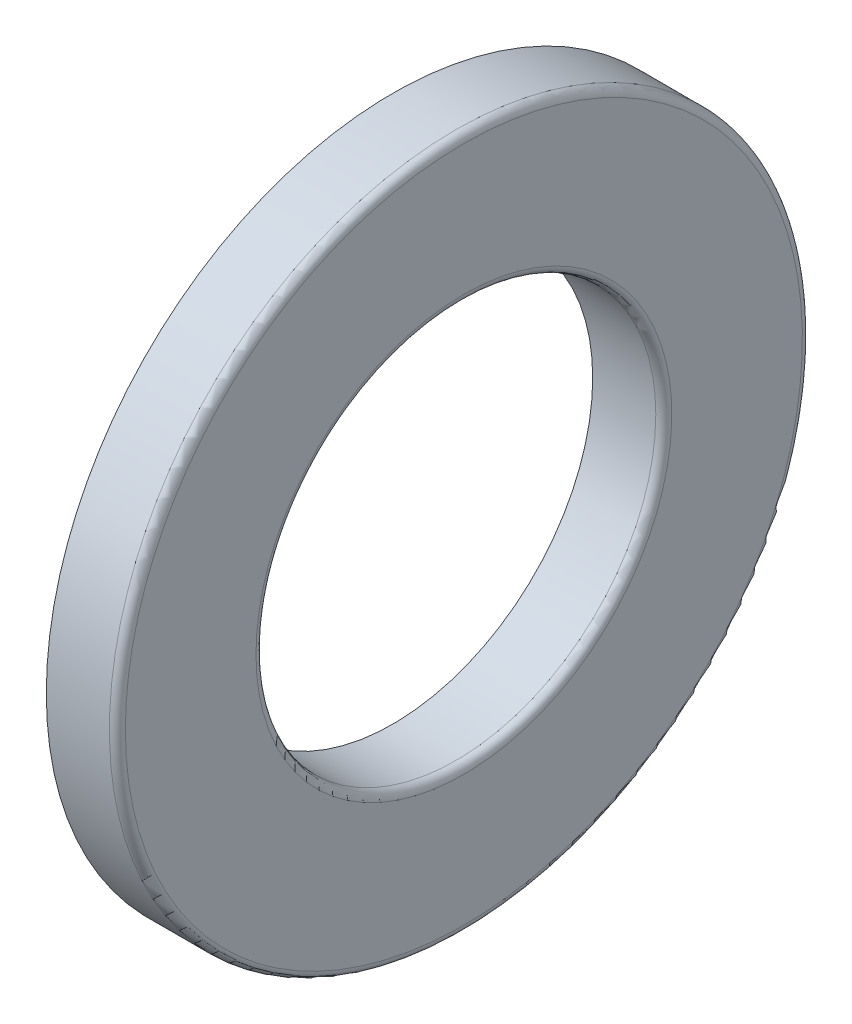
ISO-10303-21;
HEADER;
FILE_DESCRIPTION(('STEP AP214'),'2;1');
FILE_NAME('part.step','',(''),(''),'','','');
FILE_SCHEMA(('AUTOMOTIVE_DESIGN { 1 0 10303 214 1 1 1 1 }'));
ENDSEC;
DATA;
#1=APPLICATION_CONTEXT('core data for automotive mechanical design processes');
#2=APPLICATION_PROTOCOL_DEFINITION('international standard','automotive_design',2000,#1);
#3=PRODUCT_CONTEXT('',#1,'mechanical');
#4=PRODUCT('Part','Part','',(#3));
#5=PRODUCT_RELATED_PRODUCT_CATEGORY('part','',(#4));
#6=PRODUCT_DEFINITION_FORMATION('','',#4);
#7=PRODUCT_DEFINITION_CONTEXT('part definition',#1,'design');
#8=PRODUCT_DEFINITION('design','',#6,#7);
#9=PRODUCT_DEFINITION_SHAPE('','',#8);
#10=(LENGTH_UNIT() NAMED_UNIT(*) SI_UNIT(.MILLI.,.METRE.));
#11=(NAMED_UNIT(*) PLANE_ANGLE_UNIT() SI_UNIT($,.RADIAN.));
#12=(NAMED_UNIT(*) SI_UNIT($,.STERADIAN.) SOLID_ANGLE_UNIT());
#13=UNCERTAINTY_MEASURE_WITH_UNIT(LENGTH_MEASURE(1.E-05),#10,'distance_accuracy_value','');
#14=(GEOMETRIC_REPRESENTATION_CONTEXT(3) GLOBAL_UNCERTAINTY_ASSIGNED_CONTEXT((#13)) GLOBAL_UNIT_ASSIGNED_CONTEXT((#10,
#11,#12)) REPRESENTATION_CONTEXT('',''));
#15=CARTESIAN_POINT('',(0.,0.,0.));
#16=DIRECTION('',(0.,0.,1.));
#17=DIRECTION('',(1.,0.,0.));
#18=AXIS2_PLACEMENT_3D('',#15,#16,#17);
#19=CARTESIAN_POINT('',(8.,0.,0.));
#20=DIRECTION('',(1.,0.,0.));
#21=DIRECTION('',(0.,1.,0.));
#22=AXIS2_PLACEMENT_3D('',#19,#20,#21);
#23=TOROIDAL_SURFACE('',#22,21.,3.2);
#24=CARTESIAN_POINT('',(10.6666666666667,0.,0.));
#25=DIRECTION('',(1.,0.,0.));
#26=DIRECTION('',(0.,0.,-1.));
#27=AXIS2_PLACEMENT_3D('',#24,#25,#26);
#28=CIRCLE('',#27,19.2311334451438);
#29=CARTESIAN_POINT('',(10.6666666666667,0.,-19.2311334451438));
#30=VERTEX_POINT('',#29);
#31=EDGE_CURVE('E18',#30,#30,#28,.F.);
#32=ORIENTED_EDGE('',*,*,#31,.F.);
#33=EDGE_LOOP('',(#32));
#34=FACE_BOUND('',#33,.T.);
#35=CARTESIAN_POINT('',(10.6666666666667,0.,0.));
#36=DIRECTION('',(1.,0.,0.));
#37=DIRECTION('',(0.,0.,-1.));
#38=AXIS2_PLACEMENT_3D('',#35,#36,#37);
#39=CIRCLE('',#38,22.7688665548562);
#40=CARTESIAN_POINT('',(10.6666666666667,0.,-22.7688665548562));
#41=VERTEX_POINT('',#40);
#42=EDGE_CURVE('E52',#41,#41,#39,.T.);
#43=ORIENTED_EDGE('',*,*,#42,.F.);
#44=EDGE_LOOP('',(#43));
#45=FACE_BOUND('',#44,.T.);
#46=ADVANCED_FACE('F14',(#34,#45),#23,.F.);
#47=CARTESIAN_POINT('',(10.6666666666667,0.,20.5));
#48=DIRECTION('',(-1.,0.,0.));
#49=DIRECTION('',(0.,0.,1.));
#50=AXIS2_PLACEMENT_3D('',#47,#48,#49);
#51=PLANE('',#50);
#52=CARTESIAN_POINT('',(10.6666666666667,0.,0.));
#53=DIRECTION('',(1.,0.,0.));
#54=DIRECTION('',(0.,0.,-1.));
#55=AXIS2_PLACEMENT_3D('',#52,#53,#54);
#56=CIRCLE('',#55,15.00000000005);
#57=CARTESIAN_POINT('',(10.6666666666667,0.,-15.00000000005));
#58=VERTEX_POINT('',#57);
#59=EDGE_CURVE('E50',#58,#58,#56,.F.);
#60=ORIENTED_EDGE('',*,*,#59,.F.);
#61=EDGE_LOOP('',(#60));
#62=FACE_BOUND('',#61,.T.);
#63=ORIENTED_EDGE('',*,*,#31,.T.);
#64=EDGE_LOOP('',(#63));
#65=FACE_BOUND('',#64,.T.);
#66=ADVANCED_FACE('F59',(#62,#65),#51,.T.);
#67=CARTESIAN_POINT('',(10.6666666666667,0.,20.5));
#68=DIRECTION('',(-1.,0.,0.));
#69=DIRECTION('',(0.,0.,1.));
#70=AXIS2_PLACEMENT_3D('',#67,#68,#69);
#71=PLANE('',#70);
#72=CARTESIAN_POINT('',(10.6666666666667,0.,0.));
#73=DIRECTION('',(1.,0.,0.));
#74=DIRECTION('',(0.,0.,-1.));
#75=AXIS2_PLACEMENT_3D('',#72,#73,#74);
#76=CIRCLE('',#75,26.);
#77=CARTESIAN_POINT('',(10.6666666666667,0.,-26.));
#78=VERTEX_POINT('',#77);
#79=EDGE_CURVE('E37',#78,#78,#76,.T.);
#80=ORIENTED_EDGE('',*,*,#79,.F.);
#81=EDGE_LOOP('',(#80));
#82=FACE_BOUND('',#81,.T.);
#83=ORIENTED_EDGE('',*,*,#42,.T.);
#84=EDGE_LOOP('',(#83));
#85=FACE_BOUND('',#84,.T.);
#86=ADVANCED_FACE('F67',(#82,#85),#71,.T.);
#87=CARTESIAN_POINT('',(10.6666666666667,0.,0.));
#88=DIRECTION('',(1.,0.,0.));
#89=DIRECTION('',(0.,0.,-1.));
#90=AXIS2_PLACEMENT_3D('',#87,#88,#89);
#91=CYLINDRICAL_SURFACE('',#90,15.00000000005);
#92=ORIENTED_EDGE('',*,*,#59,.T.);
#93=EDGE_LOOP('',(#92));
#94=FACE_BOUND('',#93,.T.);
#95=CARTESIAN_POINT('',(15.4,0.,0.));
#96=DIRECTION('',(1.,0.,0.));
#97=DIRECTION('',(0.,1.,0.));
#98=AXIS2_PLACEMENT_3D('',#95,#96,#97);
#99=CIRCLE('',#98,15.0000000001);
#100=CARTESIAN_POINT('',(15.4,15.0000000001,0.));
#101=VERTEX_POINT('',#100);
#102=EDGE_CURVE('E32',#101,#101,#99,.F.);
#103=ORIENTED_EDGE('',*,*,#102,.F.);
#104=EDGE_LOOP('',(#103));
#105=FACE_BOUND('',#104,.T.);
#106=ADVANCED_FACE('F113',(#94,#105),#91,.F.);
#107=CARTESIAN_POINT('',(13.0333333333333,0.,0.));
#108=DIRECTION('',(1.,0.,0.));
#109=DIRECTION('',(0.,0.,-1.));
#110=AXIS2_PLACEMENT_3D('',#107,#108,#109);
#111=CYLINDRICAL_SURFACE('',#110,26.);
#112=CARTESIAN_POINT('',(15.3999999997293,0.,0.));
#113=DIRECTION('',(1.,0.,0.));
#114=DIRECTION('',(0.,1.,0.));
#115=AXIS2_PLACEMENT_3D('',#112,#113,#114);
#116=CIRCLE('',#115,26.);
#117=CARTESIAN_POINT('',(15.3999999997293,26.,0.));
#118=VERTEX_POINT('',#117);
#119=EDGE_CURVE('E27',#118,#118,#116,.T.);
#120=ORIENTED_EDGE('',*,*,#119,.F.);
#121=EDGE_LOOP('',(#120));
#122=FACE_BOUND('',#121,.T.);
#123=ORIENTED_EDGE('',*,*,#79,.T.);
#124=EDGE_LOOP('',(#123));
#125=FACE_BOUND('',#124,.T.);
#126=ADVANCED_FACE('F109',(#122,#125),#111,.T.);
#127=CARTESIAN_POINT('',(15.3999999998293,0.,0.));
#128=DIRECTION('',(1.,0.,0.));
#129=DIRECTION('',(0.,1.,0.));
#130=AXIS2_PLACEMENT_3D('',#127,#128,#129);
#131=TOROIDAL_SURFACE('',#130,15.6000000002707,0.600000000170715);
#132=CARTESIAN_POINT('',(16.,0.,0.));
#133=DIRECTION('',(1.,0.,0.));
#134=DIRECTION('',(0.,0.,1.));
#135=AXIS2_PLACEMENT_3D('',#132,#133,#134);
#136=CIRCLE('',#135,15.6);
#137=CARTESIAN_POINT('',(16.,0.,15.6));
#138=VERTEX_POINT('',#137);
#139=EDGE_CURVE('E22',#138,#138,#136,.F.);
#140=ORIENTED_EDGE('',*,*,#139,.F.);
#141=EDGE_LOOP('',(#140));
#142=FACE_BOUND('',#141,.T.);
#143=ORIENTED_EDGE('',*,*,#102,.T.);
#144=EDGE_LOOP('',(#143));
#145=FACE_BOUND('',#144,.T.);
#146=ADVANCED_FACE('F76',(#142,#145),#131,.T.);
#147=CARTESIAN_POINT('',(15.3999999997293,0.,0.));
#148=DIRECTION('',(1.,0.,0.));
#149=DIRECTION('',(0.,1.,0.));
#150=AXIS2_PLACEMENT_3D('',#147,#148,#149);
#151=TOROIDAL_SURFACE('',#150,25.3999999998293,0.600000000170709);
#152=ORIENTED_EDGE('',*,*,#119,.T.);
#153=EDGE_LOOP('',(#152));
#154=FACE_BOUND('',#153,.T.);
#155=CARTESIAN_POINT('',(15.9999999999,0.,0.));
#156=DIRECTION('',(-1.,0.,0.));
#157=DIRECTION('',(0.,0.,1.));
#158=AXIS2_PLACEMENT_3D('',#155,#156,#157);
#159=CIRCLE('',#158,25.4);
#160=CARTESIAN_POINT('',(15.9999999999,0.,25.4));
#161=VERTEX_POINT('',#160);
#162=EDGE_CURVE('E10',#161,#161,#159,.F.);
#163=ORIENTED_EDGE('',*,*,#162,.F.);
#164=EDGE_LOOP('',(#163));
#165=FACE_BOUND('',#164,.T.);
#166=ADVANCED_FACE('F71',(#154,#165),#151,.T.);
#167=CARTESIAN_POINT('',(15.99999999995,0.,20.5));
#168=DIRECTION('',(1.,0.,0.));
#169=DIRECTION('',(0.,1.,0.));
#170=AXIS2_PLACEMENT_3D('',#167,#168,#169);
#171=PLANE('',#170);
#172=ORIENTED_EDGE('',*,*,#162,.T.);
#173=EDGE_LOOP('',(#172));
#174=FACE_BOUND('',#173,.T.);
#175=ORIENTED_EDGE('',*,*,#139,.T.);
#176=EDGE_LOOP('',(#175));
#177=FACE_BOUND('',#176,.T.);
#178=ADVANCED_FACE('F69',(#174,#177),#171,.T.);
#179=CLOSED_SHELL('',(#46,#66,#86,#106,#126,#146,#166,#178));
#180=MANIFOLD_SOLID_BREP('B1',#179);
#181=ADVANCED_BREP_SHAPE_REPRESENTATION('',(#18,#180),#14);
#182=SHAPE_DEFINITION_REPRESENTATION(#9,#181);
ENDSEC;
END-ISO-10303-21;
